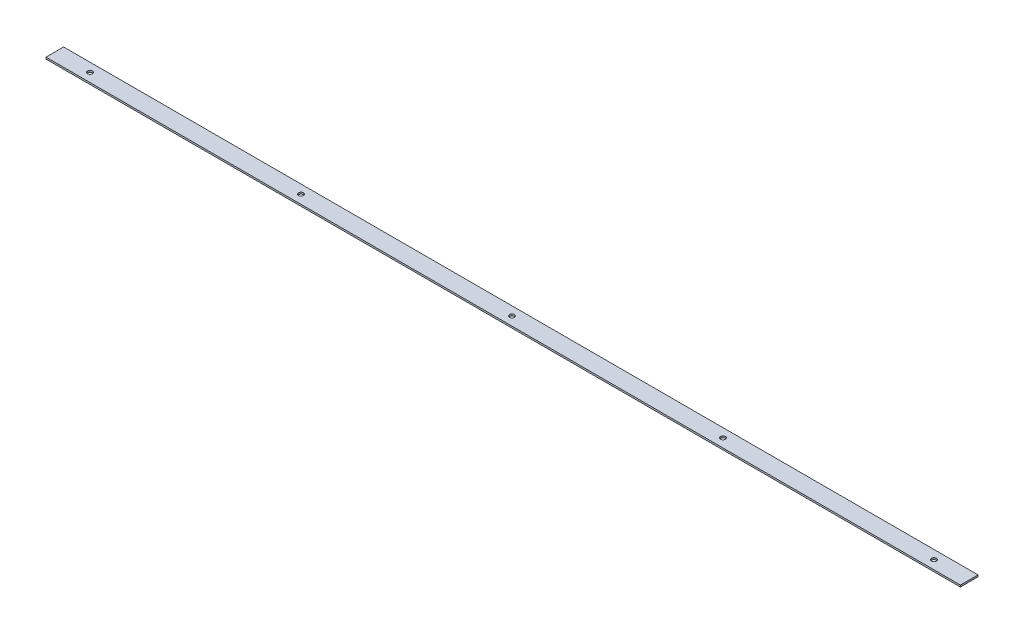
ISO-10303-21;
HEADER;
FILE_DESCRIPTION(('STEP AP214'),'2;1');
FILE_NAME('part.step','',(''),(''),'','','');
FILE_SCHEMA(('AUTOMOTIVE_DESIGN { 1 0 10303 214 1 1 1 1 }'));
ENDSEC;
DATA;
#1=APPLICATION_CONTEXT('core data for automotive mechanical design processes');
#2=APPLICATION_PROTOCOL_DEFINITION('international standard','automotive_design',2000,#1);
#3=PRODUCT_CONTEXT('',#1,'mechanical');
#4=PRODUCT('Part','Part','',(#3));
#5=PRODUCT_RELATED_PRODUCT_CATEGORY('part','',(#4));
#6=PRODUCT_DEFINITION_FORMATION('','',#4);
#7=PRODUCT_DEFINITION_CONTEXT('part definition',#1,'design');
#8=PRODUCT_DEFINITION('design','',#6,#7);
#9=PRODUCT_DEFINITION_SHAPE('','',#8);
#10=(LENGTH_UNIT() NAMED_UNIT(*) SI_UNIT(.MILLI.,.METRE.));
#11=(NAMED_UNIT(*) PLANE_ANGLE_UNIT() SI_UNIT($,.RADIAN.));
#12=(NAMED_UNIT(*) SI_UNIT($,.STERADIAN.) SOLID_ANGLE_UNIT());
#13=UNCERTAINTY_MEASURE_WITH_UNIT(LENGTH_MEASURE(1.E-05),#10,'distance_accuracy_value','');
#14=(GEOMETRIC_REPRESENTATION_CONTEXT(3) GLOBAL_UNCERTAINTY_ASSIGNED_CONTEXT((#13)) GLOBAL_UNIT_ASSIGNED_CONTEXT((#10,
#11,#12)) REPRESENTATION_CONTEXT('',''));
#15=CARTESIAN_POINT('',(0.,0.,0.));
#16=DIRECTION('',(0.,0.,1.));
#17=DIRECTION('',(1.,0.,0.));
#18=AXIS2_PLACEMENT_3D('',#15,#16,#17);
#19=CARTESIAN_POINT('',(600.,0.,0.));
#20=DIRECTION('',(0.,1.,0.));
#21=DIRECTION('',(0.,0.,1.));
#22=AXIS2_PLACEMENT_3D('',#19,#20,#21);
#23=CYLINDRICAL_SURFACE('',#22,3.50000000000008);
#24=CARTESIAN_POINT('',(600.,0.,0.));
#25=DIRECTION('',(0.,1.,0.));
#26=DIRECTION('',(0.,0.,1.));
#27=AXIS2_PLACEMENT_3D('',#24,#25,#26);
#28=CIRCLE('',#27,3.50000000000008);
#29=CARTESIAN_POINT('',(600.,0.,3.50000000000008));
#30=VERTEX_POINT('',#29);
#31=EDGE_CURVE('E41',#30,#30,#28,.T.);
#32=ORIENTED_EDGE('',*,*,#31,.F.);
#33=EDGE_LOOP('',(#32));
#34=FACE_BOUND('',#33,.T.);
#35=CARTESIAN_POINT('',(600.,2.5,0.));
#36=DIRECTION('',(0.,-1.,0.));
#37=DIRECTION('',(0.,0.,-1.));
#38=AXIS2_PLACEMENT_3D('',#35,#36,#37);
#39=CIRCLE('',#38,3.50000000000008);
#40=CARTESIAN_POINT('',(600.,2.5,-3.50000000000008));
#41=VERTEX_POINT('',#40);
#42=EDGE_CURVE('E11',#41,#41,#39,.T.);
#43=ORIENTED_EDGE('',*,*,#42,.F.);
#44=EDGE_LOOP('',(#43));
#45=FACE_BOUND('',#44,.T.);
#46=ADVANCED_FACE('F33',(#34,#45),#23,.F.);
#47=CARTESIAN_POINT('',(300.,0.,0.));
#48=DIRECTION('',(0.,1.,0.));
#49=DIRECTION('',(0.,0.,1.));
#50=AXIS2_PLACEMENT_3D('',#47,#48,#49);
#51=CYLINDRICAL_SURFACE('',#50,3.50000000000008);
#52=CARTESIAN_POINT('',(300.,0.,0.));
#53=DIRECTION('',(0.,1.,0.));
#54=DIRECTION('',(0.,0.,1.));
#55=AXIS2_PLACEMENT_3D('',#52,#53,#54);
#56=CIRCLE('',#55,3.50000000000008);
#57=CARTESIAN_POINT('',(300.,0.,3.50000000000008));
#58=VERTEX_POINT('',#57);
#59=EDGE_CURVE('E117',#58,#58,#56,.T.);
#60=ORIENTED_EDGE('',*,*,#59,.F.);
#61=EDGE_LOOP('',(#60));
#62=FACE_BOUND('',#61,.T.);
#63=CARTESIAN_POINT('',(300.,2.5,0.));
#64=DIRECTION('',(0.,-1.,0.));
#65=DIRECTION('',(0.,0.,-1.));
#66=AXIS2_PLACEMENT_3D('',#63,#64,#65);
#67=CIRCLE('',#66,3.50000000000008);
#68=CARTESIAN_POINT('',(300.,2.5,-3.50000000000008));
#69=VERTEX_POINT('',#68);
#70=EDGE_CURVE('E120',#69,#69,#67,.T.);
#71=ORIENTED_EDGE('',*,*,#70,.F.);
#72=EDGE_LOOP('',(#71));
#73=FACE_BOUND('',#72,.T.);
#74=ADVANCED_FACE('F129',(#62,#73),#51,.F.);
#75=CARTESIAN_POINT('',(-1.11022302462516E-13,0.,0.));
#76=DIRECTION('',(0.,1.,0.));
#77=DIRECTION('',(0.,0.,1.));
#78=AXIS2_PLACEMENT_3D('',#75,#76,#77);
#79=CYLINDRICAL_SURFACE('',#78,3.50000000000008);
#80=CARTESIAN_POINT('',(-1.11022302462516E-13,0.,0.));
#81=DIRECTION('',(0.,1.,0.));
#82=DIRECTION('',(0.,0.,1.));
#83=AXIS2_PLACEMENT_3D('',#80,#81,#82);
#84=CIRCLE('',#83,3.50000000000008);
#85=CARTESIAN_POINT('',(-1.11022302462516E-13,0.,3.50000000000008));
#86=VERTEX_POINT('',#85);
#87=EDGE_CURVE('E111',#86,#86,#84,.T.);
#88=ORIENTED_EDGE('',*,*,#87,.F.);
#89=EDGE_LOOP('',(#88));
#90=FACE_BOUND('',#89,.T.);
#91=CARTESIAN_POINT('',(-1.11022302462516E-13,2.5,0.));
#92=DIRECTION('',(0.,-1.,0.));
#93=DIRECTION('',(0.,0.,-1.));
#94=AXIS2_PLACEMENT_3D('',#91,#92,#93);
#95=CIRCLE('',#94,3.50000000000008);
#96=CARTESIAN_POINT('',(-1.11022302462516E-13,2.5,-3.50000000000008));
#97=VERTEX_POINT('',#96);
#98=EDGE_CURVE('E114',#97,#97,#95,.T.);
#99=ORIENTED_EDGE('',*,*,#98,.F.);
#100=EDGE_LOOP('',(#99));
#101=FACE_BOUND('',#100,.T.);
#102=ADVANCED_FACE('F156',(#90,#101),#79,.F.);
#103=CARTESIAN_POINT('',(650.,2.5,12.5));
#104=DIRECTION('',(-1.,0.,0.));
#105=DIRECTION('',(0.,0.,1.));
#106=AXIS2_PLACEMENT_3D('',#103,#104,#105);
#107=PLANE('',#106);
#108=DIRECTION('',(0.,0.,-1.));
#109=VECTOR('',#108,1.);
#110=CARTESIAN_POINT('',(650.,0.,12.5));
#111=LINE('',#110,#109);
#112=CARTESIAN_POINT('',(650.,0.,12.5));
#113=VERTEX_POINT('',#112);
#114=CARTESIAN_POINT('',(650.,0.,-12.5));
#115=VERTEX_POINT('',#114);
#116=EDGE_CURVE('E101',#113,#115,#111,.T.);
#117=ORIENTED_EDGE('',*,*,#116,.T.);
#118=DIRECTION('',(0.,-1.,0.));
#119=VECTOR('',#118,1.);
#120=CARTESIAN_POINT('',(650.,2.5,-12.5));
#121=LINE('',#120,#119);
#122=CARTESIAN_POINT('',(650.,2.5,-12.5));
#123=VERTEX_POINT('',#122);
#124=EDGE_CURVE('E92',#123,#115,#121,.T.);
#125=ORIENTED_EDGE('',*,*,#124,.F.);
#126=DIRECTION('',(0.,0.,-1.));
#127=VECTOR('',#126,1.);
#128=CARTESIAN_POINT('',(650.,2.5,12.5));
#129=LINE('',#128,#127);
#130=CARTESIAN_POINT('',(650.,2.5,12.5));
#131=VERTEX_POINT('',#130);
#132=EDGE_CURVE('E86',#131,#123,#129,.T.);
#133=ORIENTED_EDGE('',*,*,#132,.F.);
#134=DIRECTION('',(0.,-1.,0.));
#135=VECTOR('',#134,1.);
#136=CARTESIAN_POINT('',(650.,2.5,12.5));
#137=LINE('',#136,#135);
#138=EDGE_CURVE('E97',#131,#113,#137,.T.);
#139=ORIENTED_EDGE('',*,*,#138,.T.);
#140=EDGE_LOOP('',(#117,#125,#133,#139));
#141=FACE_BOUND('',#140,.T.);
#142=ADVANCED_FACE('F153',(#141),#107,.F.);
#143=CARTESIAN_POINT('',(-650.,2.5,-12.5));
#144=DIRECTION('',(0.,0.,1.));
#145=DIRECTION('',(1.,0.,0.));
#146=AXIS2_PLACEMENT_3D('',#143,#144,#145);
#147=PLANE('',#146);
#148=DIRECTION('',(-1.,0.,0.));
#149=VECTOR('',#148,1.);
#150=CARTESIAN_POINT('',(-650.,0.,-12.5));
#151=LINE('',#150,#149);
#152=CARTESIAN_POINT('',(-650.,0.,-12.5));
#153=VERTEX_POINT('',#152);
#154=EDGE_CURVE('E91',#115,#153,#151,.T.);
#155=ORIENTED_EDGE('',*,*,#154,.T.);
#156=DIRECTION('',(0.,-1.,0.));
#157=VECTOR('',#156,1.);
#158=CARTESIAN_POINT('',(-650.,2.5,-12.5));
#159=LINE('',#158,#157);
#160=CARTESIAN_POINT('',(-650.,2.5,-12.5));
#161=VERTEX_POINT('',#160);
#162=EDGE_CURVE('E89',#161,#153,#159,.T.);
#163=ORIENTED_EDGE('',*,*,#162,.F.);
#164=DIRECTION('',(-1.,0.,0.));
#165=VECTOR('',#164,1.);
#166=CARTESIAN_POINT('',(-650.,2.5,-12.5));
#167=LINE('',#166,#165);
#168=EDGE_CURVE('E80',#123,#161,#167,.T.);
#169=ORIENTED_EDGE('',*,*,#168,.F.);
#170=ORIENTED_EDGE('',*,*,#124,.T.);
#171=EDGE_LOOP('',(#155,#163,#169,#170));
#172=FACE_BOUND('',#171,.T.);
#173=ADVANCED_FACE('F90',(#172),#147,.F.);
#174=CARTESIAN_POINT('',(-650.,2.5,12.5));
#175=DIRECTION('',(1.,0.,0.));
#176=DIRECTION('',(0.,0.,-1.));
#177=AXIS2_PLACEMENT_3D('',#174,#175,#176);
#178=PLANE('',#177);
#179=DIRECTION('',(0.,0.,1.));
#180=VECTOR('',#179,1.);
#181=CARTESIAN_POINT('',(-650.,0.,12.5));
#182=LINE('',#181,#180);
#183=CARTESIAN_POINT('',(-650.,0.,12.5));
#184=VERTEX_POINT('',#183);
#185=EDGE_CURVE('E66',#153,#184,#182,.T.);
#186=ORIENTED_EDGE('',*,*,#185,.T.);
#187=DIRECTION('',(0.,-1.,0.));
#188=VECTOR('',#187,1.);
#189=CARTESIAN_POINT('',(-650.,2.5,12.5));
#190=LINE('',#189,#188);
#191=CARTESIAN_POINT('',(-650.,2.5,12.5));
#192=VERTEX_POINT('',#191);
#193=EDGE_CURVE('E93',#192,#184,#190,.T.);
#194=ORIENTED_EDGE('',*,*,#193,.F.);
#195=DIRECTION('',(0.,0.,1.));
#196=VECTOR('',#195,1.);
#197=CARTESIAN_POINT('',(-650.,2.5,12.5));
#198=LINE('',#197,#196);
#199=EDGE_CURVE('E84',#161,#192,#198,.T.);
#200=ORIENTED_EDGE('',*,*,#199,.F.);
#201=ORIENTED_EDGE('',*,*,#162,.T.);
#202=EDGE_LOOP('',(#186,#194,#200,#201));
#203=FACE_BOUND('',#202,.T.);
#204=ADVANCED_FACE('F95',(#203),#178,.F.);
#205=CARTESIAN_POINT('',(-650.,2.5,12.5));
#206=DIRECTION('',(0.,0.,-1.));
#207=DIRECTION('',(-1.,0.,0.));
#208=AXIS2_PLACEMENT_3D('',#205,#206,#207);
#209=PLANE('',#208);
#210=DIRECTION('',(1.,0.,0.));
#211=VECTOR('',#210,1.);
#212=CARTESIAN_POINT('',(-650.,0.,12.5));
#213=LINE('',#212,#211);
#214=EDGE_CURVE('E72',#184,#113,#213,.T.);
#215=ORIENTED_EDGE('',*,*,#214,.T.);
#216=ORIENTED_EDGE('',*,*,#138,.F.);
#217=DIRECTION('',(1.,0.,0.));
#218=VECTOR('',#217,1.);
#219=CARTESIAN_POINT('',(-650.,2.5,12.5));
#220=LINE('',#219,#218);
#221=EDGE_CURVE('E49',#192,#131,#220,.T.);
#222=ORIENTED_EDGE('',*,*,#221,.F.);
#223=ORIENTED_EDGE('',*,*,#193,.T.);
#224=EDGE_LOOP('',(#215,#216,#222,#223));
#225=FACE_BOUND('',#224,.T.);
#226=ADVANCED_FACE('F133',(#225),#209,.F.);
#227=CARTESIAN_POINT('',(0.,2.5,0.));
#228=DIRECTION('',(0.,-1.,0.));
#229=DIRECTION('',(0.,0.,-1.));
#230=AXIS2_PLACEMENT_3D('',#227,#228,#229);
#231=PLANE('',#230);
#232=CARTESIAN_POINT('',(-300.,2.5,0.));
#233=DIRECTION('',(0.,-1.,0.));
#234=DIRECTION('',(0.,0.,-1.));
#235=AXIS2_PLACEMENT_3D('',#232,#233,#234);
#236=CIRCLE('',#235,3.50000000000008);
#237=CARTESIAN_POINT('',(-300.,2.5,-3.50000000000008));
#238=VERTEX_POINT('',#237);
#239=EDGE_CURVE('E235',#238,#238,#236,.T.);
#240=ORIENTED_EDGE('',*,*,#239,.T.);
#241=EDGE_LOOP('',(#240));
#242=FACE_BOUND('',#241,.T.);
#243=CARTESIAN_POINT('',(-600.,2.5,0.));
#244=DIRECTION('',(0.,-1.,0.));
#245=DIRECTION('',(0.,0.,-1.));
#246=AXIS2_PLACEMENT_3D('',#243,#244,#245);
#247=CIRCLE('',#246,3.50000000000008);
#248=CARTESIAN_POINT('',(-600.,2.5,-3.50000000000008));
#249=VERTEX_POINT('',#248);
#250=EDGE_CURVE('E104',#249,#249,#247,.T.);
#251=ORIENTED_EDGE('',*,*,#250,.T.);
#252=EDGE_LOOP('',(#251));
#253=FACE_BOUND('',#252,.T.);
#254=ORIENTED_EDGE('',*,*,#132,.T.);
#255=ORIENTED_EDGE('',*,*,#168,.T.);
#256=ORIENTED_EDGE('',*,*,#199,.T.);
#257=ORIENTED_EDGE('',*,*,#221,.T.);
#258=EDGE_LOOP('',(#254,#255,#256,#257));
#259=FACE_BOUND('',#258,.T.);
#260=ORIENTED_EDGE('',*,*,#98,.T.);
#261=EDGE_LOOP('',(#260));
#262=FACE_BOUND('',#261,.T.);
#263=ORIENTED_EDGE('',*,*,#70,.T.);
#264=EDGE_LOOP('',(#263));
#265=FACE_BOUND('',#264,.T.);
#266=ORIENTED_EDGE('',*,*,#42,.T.);
#267=EDGE_LOOP('',(#266));
#268=FACE_BOUND('',#267,.T.);
#269=ADVANCED_FACE('F81',(#242,#253,#259,#262,#265,#268),#231,.F.);
#270=CARTESIAN_POINT('',(0.,0.,0.));
#271=DIRECTION('',(0.,-1.,0.));
#272=DIRECTION('',(0.,0.,-1.));
#273=AXIS2_PLACEMENT_3D('',#270,#271,#272);
#274=PLANE('',#273);
#275=CARTESIAN_POINT('',(-300.,0.,0.));
#276=DIRECTION('',(0.,1.,0.));
#277=DIRECTION('',(0.,0.,1.));
#278=AXIS2_PLACEMENT_3D('',#275,#276,#277);
#279=CIRCLE('',#278,3.50000000000008);
#280=CARTESIAN_POINT('',(-300.,0.,3.50000000000008));
#281=VERTEX_POINT('',#280);
#282=EDGE_CURVE('E233',#281,#281,#279,.T.);
#283=ORIENTED_EDGE('',*,*,#282,.T.);
#284=EDGE_LOOP('',(#283));
#285=FACE_BOUND('',#284,.T.);
#286=CARTESIAN_POINT('',(-600.,0.,0.));
#287=DIRECTION('',(0.,1.,0.));
#288=DIRECTION('',(0.,0.,1.));
#289=AXIS2_PLACEMENT_3D('',#286,#287,#288);
#290=CIRCLE('',#289,3.50000000000008);
#291=CARTESIAN_POINT('',(-600.,0.,3.50000000000008));
#292=VERTEX_POINT('',#291);
#293=EDGE_CURVE('E236',#292,#292,#290,.T.);
#294=ORIENTED_EDGE('',*,*,#293,.T.);
#295=EDGE_LOOP('',(#294));
#296=FACE_BOUND('',#295,.T.);
#297=ORIENTED_EDGE('',*,*,#116,.F.);
#298=ORIENTED_EDGE('',*,*,#214,.F.);
#299=ORIENTED_EDGE('',*,*,#185,.F.);
#300=ORIENTED_EDGE('',*,*,#154,.F.);
#301=EDGE_LOOP('',(#297,#298,#299,#300));
#302=FACE_BOUND('',#301,.T.);
#303=ORIENTED_EDGE('',*,*,#87,.T.);
#304=EDGE_LOOP('',(#303));
#305=FACE_BOUND('',#304,.T.);
#306=ORIENTED_EDGE('',*,*,#59,.T.);
#307=EDGE_LOOP('',(#306));
#308=FACE_BOUND('',#307,.T.);
#309=ORIENTED_EDGE('',*,*,#31,.T.);
#310=EDGE_LOOP('',(#309));
#311=FACE_BOUND('',#310,.T.);
#312=ADVANCED_FACE('F125',(#285,#296,#302,#305,#308,#311),#274,.T.);
#313=CARTESIAN_POINT('',(-600.,0.,0.));
#314=DIRECTION('',(0.,1.,0.));
#315=DIRECTION('',(0.,0.,1.));
#316=AXIS2_PLACEMENT_3D('',#313,#314,#315);
#317=CYLINDRICAL_SURFACE('',#316,3.50000000000008);
#318=ORIENTED_EDGE('',*,*,#293,.F.);
#319=EDGE_LOOP('',(#318));
#320=FACE_BOUND('',#319,.T.);
#321=ORIENTED_EDGE('',*,*,#250,.F.);
#322=EDGE_LOOP('',(#321));
#323=FACE_BOUND('',#322,.T.);
#324=ADVANCED_FACE('F140',(#320,#323),#317,.F.);
#325=CARTESIAN_POINT('',(-300.,0.,0.));
#326=DIRECTION('',(0.,1.,0.));
#327=DIRECTION('',(0.,0.,1.));
#328=AXIS2_PLACEMENT_3D('',#325,#326,#327);
#329=CYLINDRICAL_SURFACE('',#328,3.50000000000008);
#330=ORIENTED_EDGE('',*,*,#282,.F.);
#331=EDGE_LOOP('',(#330));
#332=FACE_BOUND('',#331,.T.);
#333=ORIENTED_EDGE('',*,*,#239,.F.);
#334=EDGE_LOOP('',(#333));
#335=FACE_BOUND('',#334,.T.);
#336=ADVANCED_FACE('F200',(#332,#335),#329,.F.);
#337=CLOSED_SHELL('',(#46,#74,#102,#142,#173,#204,#226,#269,#312,#324,#336));
#338=MANIFOLD_SOLID_BREP('B2',#337);
#339=ADVANCED_BREP_SHAPE_REPRESENTATION('',(#18,#338),#14);
#340=SHAPE_DEFINITION_REPRESENTATION(#9,#339);
ENDSEC;
END-ISO-10303-21;
